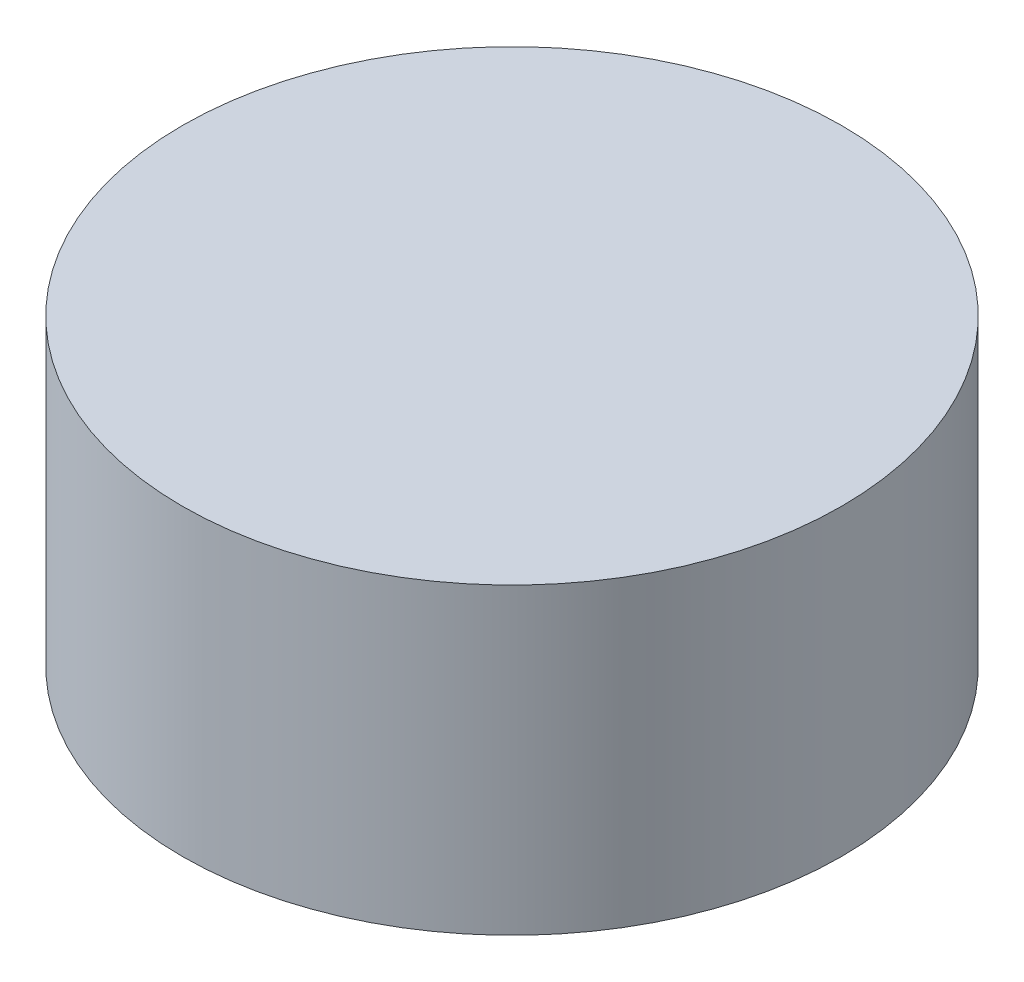
ISO-10303-21;
HEADER;
FILE_DESCRIPTION(('STEP AP214'),'2;1');
FILE_NAME('part.step','',(''),(''),'','','');
FILE_SCHEMA(('AUTOMOTIVE_DESIGN { 1 0 10303 214 1 1 1 1 }'));
ENDSEC;
DATA;
#1=APPLICATION_CONTEXT('core data for automotive mechanical design processes');
#2=APPLICATION_PROTOCOL_DEFINITION('international standard','automotive_design',2000,#1);
#3=PRODUCT_CONTEXT('',#1,'mechanical');
#4=PRODUCT('Part','Part','',(#3));
#5=PRODUCT_RELATED_PRODUCT_CATEGORY('part','',(#4));
#6=PRODUCT_DEFINITION_FORMATION('','',#4);
#7=PRODUCT_DEFINITION_CONTEXT('part definition',#1,'design');
#8=PRODUCT_DEFINITION('design','',#6,#7);
#9=PRODUCT_DEFINITION_SHAPE('','',#8);
#10=(LENGTH_UNIT() NAMED_UNIT(*) SI_UNIT(.MILLI.,.METRE.));
#11=(NAMED_UNIT(*) PLANE_ANGLE_UNIT() SI_UNIT($,.RADIAN.));
#12=(NAMED_UNIT(*) SI_UNIT($,.STERADIAN.) SOLID_ANGLE_UNIT());
#13=UNCERTAINTY_MEASURE_WITH_UNIT(LENGTH_MEASURE(1.E-05),#10,'distance_accuracy_value','');
#14=(GEOMETRIC_REPRESENTATION_CONTEXT(3) GLOBAL_UNCERTAINTY_ASSIGNED_CONTEXT((#13)) GLOBAL_UNIT_ASSIGNED_CONTEXT((#10,
#11,#12)) REPRESENTATION_CONTEXT('',''));
#15=CARTESIAN_POINT('',(0.,0.,0.));
#16=DIRECTION('',(0.,0.,1.));
#17=DIRECTION('',(1.,0.,0.));
#18=AXIS2_PLACEMENT_3D('',#15,#16,#17);
#19=CARTESIAN_POINT('',(0.,23.0000000000019,0.));
#20=DIRECTION('',(0.,-1.,0.));
#21=DIRECTION('',(0.,0.,-1.));
#22=AXIS2_PLACEMENT_3D('',#19,#20,#21);
#23=CYLINDRICAL_SURFACE('',#22,50.);
#24=CARTESIAN_POINT('',(0.,23.0000000000019,0.));
#25=DIRECTION('',(0.,1.,0.));
#26=DIRECTION('',(0.,0.,1.));
#27=AXIS2_PLACEMENT_3D('',#24,#25,#26);
#28=CIRCLE('',#27,50.);
#29=CARTESIAN_POINT('',(0.,23.0000000000019,50.));
#30=VERTEX_POINT('',#29);
#31=EDGE_CURVE('E10',#30,#30,#28,.T.);
#32=ORIENTED_EDGE('',*,*,#31,.F.);
#33=EDGE_LOOP('',(#32));
#34=FACE_BOUND('',#33,.T.);
#35=CARTESIAN_POINT('',(0.,-23.0000000000019,0.));
#36=DIRECTION('',(0.,1.,0.));
#37=DIRECTION('',(0.,0.,1.));
#38=AXIS2_PLACEMENT_3D('',#35,#36,#37);
#39=CIRCLE('',#38,50.);
#40=CARTESIAN_POINT('',(0.,-23.0000000000019,50.));
#41=VERTEX_POINT('',#40);
#42=EDGE_CURVE('E37',#41,#41,#39,.T.);
#43=ORIENTED_EDGE('',*,*,#42,.T.);
#44=EDGE_LOOP('',(#43));
#45=FACE_BOUND('',#44,.T.);
#46=ADVANCED_FACE('F31',(#34,#45),#23,.T.);
#47=CARTESIAN_POINT('',(0.,23.0000000000019,0.));
#48=DIRECTION('',(0.,1.,0.));
#49=DIRECTION('',(0.,0.,1.));
#50=AXIS2_PLACEMENT_3D('',#47,#48,#49);
#51=PLANE('',#50);
#52=ORIENTED_EDGE('',*,*,#31,.T.);
#53=EDGE_LOOP('',(#52));
#54=FACE_BOUND('',#53,.T.);
#55=ADVANCED_FACE('F46',(#54),#51,.T.);
#56=CARTESIAN_POINT('',(0.,-23.0000000000019,0.));
#57=DIRECTION('',(0.,1.,0.));
#58=DIRECTION('',(0.,0.,1.));
#59=AXIS2_PLACEMENT_3D('',#56,#57,#58);
#60=PLANE('',#59);
#61=ORIENTED_EDGE('',*,*,#42,.F.);
#62=EDGE_LOOP('',(#61));
#63=FACE_BOUND('',#62,.T.);
#64=ADVANCED_FACE('F44',(#63),#60,.F.);
#65=CLOSED_SHELL('',(#46,#55,#64));
#66=MANIFOLD_SOLID_BREP('B2',#65);
#67=ADVANCED_BREP_SHAPE_REPRESENTATION('',(#18,#66),#14);
#68=SHAPE_DEFINITION_REPRESENTATION(#9,#67);
ENDSEC;
END-ISO-10303-21;
